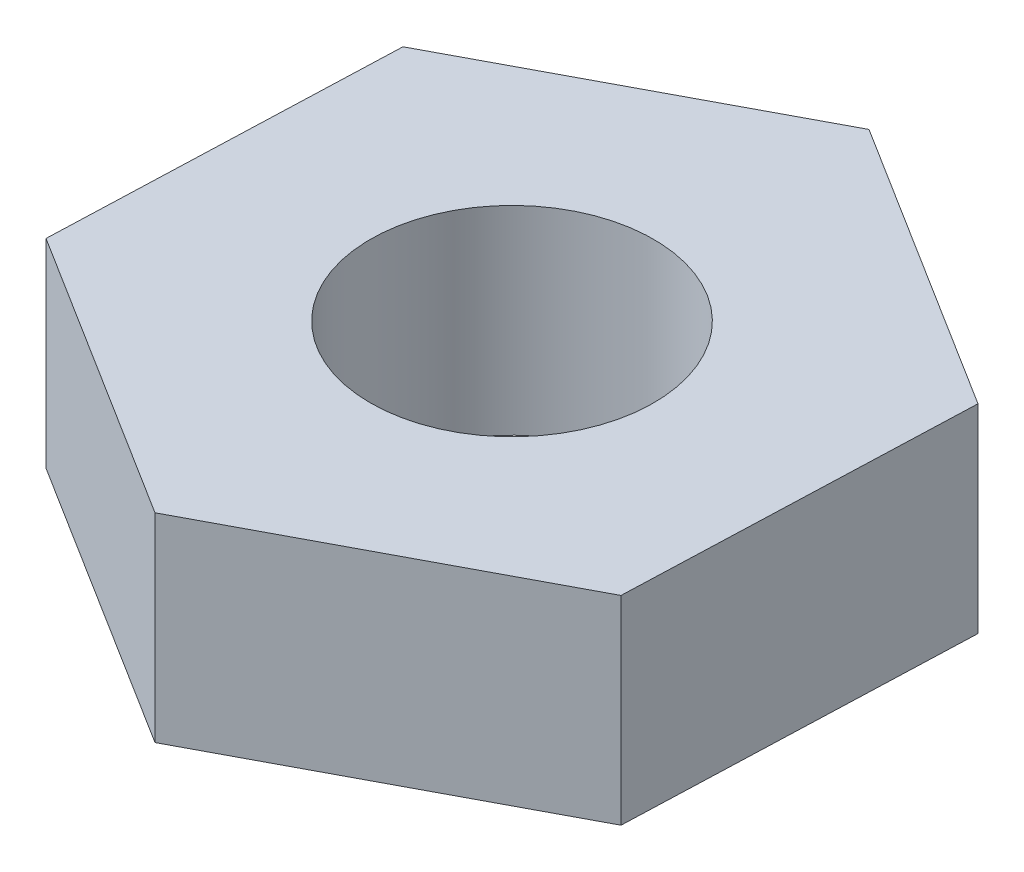
ISO-10303-21;
HEADER;
FILE_DESCRIPTION(('STEP AP214'),'2;1');
FILE_NAME('part.step','',(''),(''),'','','');
FILE_SCHEMA(('AUTOMOTIVE_DESIGN { 1 0 10303 214 1 1 1 1 }'));
ENDSEC;
DATA;
#1=APPLICATION_CONTEXT('core data for automotive mechanical design processes');
#2=APPLICATION_PROTOCOL_DEFINITION('international standard','automotive_design',2000,#1);
#3=PRODUCT_CONTEXT('',#1,'mechanical');
#4=PRODUCT('Part','Part','',(#3));
#5=PRODUCT_RELATED_PRODUCT_CATEGORY('part','',(#4));
#6=PRODUCT_DEFINITION_FORMATION('','',#4);
#7=PRODUCT_DEFINITION_CONTEXT('part definition',#1,'design');
#8=PRODUCT_DEFINITION('design','',#6,#7);
#9=PRODUCT_DEFINITION_SHAPE('','',#8);
#10=(LENGTH_UNIT() NAMED_UNIT(*) SI_UNIT(.MILLI.,.METRE.));
#11=(NAMED_UNIT(*) PLANE_ANGLE_UNIT() SI_UNIT($,.RADIAN.));
#12=(NAMED_UNIT(*) SI_UNIT($,.STERADIAN.) SOLID_ANGLE_UNIT());
#13=UNCERTAINTY_MEASURE_WITH_UNIT(LENGTH_MEASURE(1.E-05),#10,'distance_accuracy_value','');
#14=(GEOMETRIC_REPRESENTATION_CONTEXT(3) GLOBAL_UNCERTAINTY_ASSIGNED_CONTEXT((#13)) GLOBAL_UNIT_ASSIGNED_CONTEXT((#10,
#11,#12)) REPRESENTATION_CONTEXT('',''));
#15=CARTESIAN_POINT('',(0.,0.,0.));
#16=DIRECTION('',(0.,0.,1.));
#17=DIRECTION('',(1.,0.,0.));
#18=AXIS2_PLACEMENT_3D('',#15,#16,#17);
#19=CARTESIAN_POINT('',(-0.0997809781891739,1.5875,2.74781959131083));
#20=DIRECTION('',(-0.468243591350759,0.,-0.883599422339639));
#21=DIRECTION('',(-0.883599422339639,0.,0.468243591350759));
#22=AXIS2_PLACEMENT_3D('',#19,#20,#21);
#23=PLANE('',#22);
#24=DIRECTION('',(0.883599422339639,0.,-0.468243591350759));
#25=VECTOR('',#24,1.);
#26=CARTESIAN_POINT('',(-0.0997809781891739,0.,2.74781959131083));
#27=LINE('',#26,#25);
#28=CARTESIAN_POINT('',(-0.0997809781891739,0.,2.74781959131083));
#29=VERTEX_POINT('',#28);
#30=CARTESIAN_POINT('',(2.32979108199716,0.,1.4603226575817));
#31=VERTEX_POINT('',#30);
#32=EDGE_CURVE('E119',#29,#31,#27,.T.);
#33=ORIENTED_EDGE('',*,*,#32,.T.);
#34=DIRECTION('',(0.,-1.,0.));
#35=VECTOR('',#34,1.);
#36=CARTESIAN_POINT('',(2.32979108199716,1.5875,1.4603226575817));
#37=LINE('',#36,#35);
#38=CARTESIAN_POINT('',(2.32979108199716,1.5875,1.4603226575817));
#39=VERTEX_POINT('',#38);
#40=EDGE_CURVE('E11',#39,#31,#37,.T.);
#41=ORIENTED_EDGE('',*,*,#40,.F.);
#42=DIRECTION('',(0.883599422339639,0.,-0.468243591350759));
#43=VECTOR('',#42,1.);
#44=CARTESIAN_POINT('',(-0.0997809781891739,1.5875,2.74781959131083));
#45=LINE('',#44,#43);
#46=CARTESIAN_POINT('',(-0.0997809781891739,1.5875,2.74781959131083));
#47=VERTEX_POINT('',#46);
#48=EDGE_CURVE('E130',#47,#39,#45,.T.);
#49=ORIENTED_EDGE('',*,*,#48,.F.);
#50=DIRECTION('',(0.,-1.,0.));
#51=VECTOR('',#50,1.);
#52=CARTESIAN_POINT('',(-0.0997809781891739,1.5875,2.74781959131083));
#53=LINE('',#52,#51);
#54=EDGE_CURVE('E115',#47,#29,#53,.T.);
#55=ORIENTED_EDGE('',*,*,#54,.T.);
#56=EDGE_LOOP('',(#33,#41,#49,#55));
#57=FACE_BOUND('',#56,.T.);
#58=ADVANCED_FACE('F35',(#57),#23,.F.);
#59=CARTESIAN_POINT('',(2.32979108199716,1.5875,1.4603226575817));
#60=DIRECTION('',(-0.999341342190762,0.,-0.0362888659008025));
#61=DIRECTION('',(-0.0362888659008025,0.,0.999341342190762));
#62=AXIS2_PLACEMENT_3D('',#59,#60,#61);
#63=PLANE('',#62);
#64=DIRECTION('',(0.0362888659008025,0.,-0.999341342190762));
#65=VECTOR('',#64,1.);
#66=CARTESIAN_POINT('',(2.32979108199716,0.,1.4603226575817));
#67=LINE('',#66,#65);
#68=CARTESIAN_POINT('',(2.42957206018634,0.,-1.28749693372913));
#69=VERTEX_POINT('',#68);
#70=EDGE_CURVE('E122',#31,#69,#67,.T.);
#71=ORIENTED_EDGE('',*,*,#70,.T.);
#72=DIRECTION('',(0.,-1.,0.));
#73=VECTOR('',#72,1.);
#74=CARTESIAN_POINT('',(2.42957206018634,1.5875,-1.28749693372913));
#75=LINE('',#74,#73);
#76=CARTESIAN_POINT('',(2.42957206018634,1.5875,-1.28749693372913));
#77=VERTEX_POINT('',#76);
#78=EDGE_CURVE('E43',#77,#69,#75,.T.);
#79=ORIENTED_EDGE('',*,*,#78,.F.);
#80=DIRECTION('',(0.0362888659008025,0.,-0.999341342190762));
#81=VECTOR('',#80,1.);
#82=CARTESIAN_POINT('',(2.32979108199716,1.5875,1.4603226575817));
#83=LINE('',#82,#81);
#84=EDGE_CURVE('E88',#39,#77,#83,.T.);
#85=ORIENTED_EDGE('',*,*,#84,.F.);
#86=ORIENTED_EDGE('',*,*,#40,.T.);
#87=EDGE_LOOP('',(#71,#79,#85,#86));
#88=FACE_BOUND('',#87,.T.);
#89=ADVANCED_FACE('F156',(#88),#63,.F.);
#90=CARTESIAN_POINT('',(2.42957206018634,1.5875,-1.28749693372913));
#91=DIRECTION('',(-0.531097750840003,0.,0.847310556438836));
#92=DIRECTION('',(0.847310556438836,0.,0.531097750840003));
#93=AXIS2_PLACEMENT_3D('',#90,#91,#92);
#94=PLANE('',#93);
#95=DIRECTION('',(-0.847310556438836,0.,-0.531097750840003));
#96=VECTOR('',#95,1.);
#97=CARTESIAN_POINT('',(2.42957206018634,0.,-1.28749693372913));
#98=LINE('',#97,#96);
#99=CARTESIAN_POINT('',(0.0997809781891751,0.,-2.74781959131083));
#100=VERTEX_POINT('',#99);
#101=EDGE_CURVE('E125',#69,#100,#98,.T.);
#102=ORIENTED_EDGE('',*,*,#101,.T.);
#103=DIRECTION('',(0.,-1.,0.));
#104=VECTOR('',#103,1.);
#105=CARTESIAN_POINT('',(0.0997809781891751,1.5875,-2.74781959131083));
#106=LINE('',#105,#104);
#107=CARTESIAN_POINT('',(0.0997809781891751,1.5875,-2.74781959131083));
#108=VERTEX_POINT('',#107);
#109=EDGE_CURVE('E110',#108,#100,#106,.T.);
#110=ORIENTED_EDGE('',*,*,#109,.F.);
#111=DIRECTION('',(-0.847310556438836,0.,-0.531097750840003));
#112=VECTOR('',#111,1.);
#113=CARTESIAN_POINT('',(2.42957206018634,1.5875,-1.28749693372913));
#114=LINE('',#113,#112);
#115=EDGE_CURVE('E101',#77,#108,#114,.T.);
#116=ORIENTED_EDGE('',*,*,#115,.F.);
#117=ORIENTED_EDGE('',*,*,#78,.T.);
#118=EDGE_LOOP('',(#102,#110,#116,#117));
#119=FACE_BOUND('',#118,.T.);
#120=ADVANCED_FACE('F136',(#119),#94,.F.);
#121=CARTESIAN_POINT('',(0.0997809781891751,1.5875,-2.74781959131083));
#122=DIRECTION('',(0.468243591350759,0.,0.883599422339639));
#123=DIRECTION('',(0.883599422339639,0.,-0.468243591350759));
#124=AXIS2_PLACEMENT_3D('',#121,#122,#123);
#125=PLANE('',#124);
#126=DIRECTION('',(-0.883599422339639,0.,0.468243591350759));
#127=VECTOR('',#126,1.);
#128=CARTESIAN_POINT('',(0.0997809781891751,0.,-2.74781959131083));
#129=LINE('',#128,#127);
#130=CARTESIAN_POINT('',(-2.32979108199716,0.,-1.4603226575817));
#131=VERTEX_POINT('',#130);
#132=EDGE_CURVE('E109',#100,#131,#129,.T.);
#133=ORIENTED_EDGE('',*,*,#132,.T.);
#134=DIRECTION('',(0.,-1.,0.));
#135=VECTOR('',#134,1.);
#136=CARTESIAN_POINT('',(-2.32979108199716,1.5875,-1.4603226575817));
#137=LINE('',#136,#135);
#138=CARTESIAN_POINT('',(-2.32979108199716,1.5875,-1.4603226575817));
#139=VERTEX_POINT('',#138);
#140=EDGE_CURVE('E106',#139,#131,#137,.T.);
#141=ORIENTED_EDGE('',*,*,#140,.F.);
#142=DIRECTION('',(-0.883599422339639,0.,0.468243591350759));
#143=VECTOR('',#142,1.);
#144=CARTESIAN_POINT('',(0.0997809781891751,1.5875,-2.74781959131083));
#145=LINE('',#144,#143);
#146=EDGE_CURVE('E95',#108,#139,#145,.T.);
#147=ORIENTED_EDGE('',*,*,#146,.F.);
#148=ORIENTED_EDGE('',*,*,#109,.T.);
#149=EDGE_LOOP('',(#133,#141,#147,#148));
#150=FACE_BOUND('',#149,.T.);
#151=ADVANCED_FACE('F107',(#150),#125,.F.);
#152=CARTESIAN_POINT('',(-2.32979108199716,1.5875,-1.4603226575817));
#153=DIRECTION('',(0.999341342190762,0.,0.0362888659008027));
#154=DIRECTION('',(0.0362888659008027,0.,-0.999341342190762));
#155=AXIS2_PLACEMENT_3D('',#152,#153,#154);
#156=PLANE('',#155);
#157=DIRECTION('',(-0.0362888659008027,0.,0.999341342190762));
#158=VECTOR('',#157,1.);
#159=CARTESIAN_POINT('',(-2.32979108199716,0.,-1.4603226575817));
#160=LINE('',#159,#158);
#161=CARTESIAN_POINT('',(-2.42957206018634,0.,1.28749693372913));
#162=VERTEX_POINT('',#161);
#163=EDGE_CURVE('E74',#131,#162,#160,.T.);
#164=ORIENTED_EDGE('',*,*,#163,.T.);
#165=DIRECTION('',(0.,-1.,0.));
#166=VECTOR('',#165,1.);
#167=CARTESIAN_POINT('',(-2.42957206018634,1.5875,1.28749693372913));
#168=LINE('',#167,#166);
#169=CARTESIAN_POINT('',(-2.42957206018634,1.5875,1.28749693372913));
#170=VERTEX_POINT('',#169);
#171=EDGE_CURVE('E111',#170,#162,#168,.T.);
#172=ORIENTED_EDGE('',*,*,#171,.F.);
#173=DIRECTION('',(-0.0362888659008027,0.,0.999341342190762));
#174=VECTOR('',#173,1.);
#175=CARTESIAN_POINT('',(-2.32979108199716,1.5875,-1.4603226575817));
#176=LINE('',#175,#174);
#177=EDGE_CURVE('E99',#139,#170,#176,.T.);
#178=ORIENTED_EDGE('',*,*,#177,.F.);
#179=ORIENTED_EDGE('',*,*,#140,.T.);
#180=EDGE_LOOP('',(#164,#172,#178,#179));
#181=FACE_BOUND('',#180,.T.);
#182=ADVANCED_FACE('F113',(#181),#156,.F.);
#183=CARTESIAN_POINT('',(-2.42957206018634,1.5875,1.28749693372913));
#184=DIRECTION('',(0.531097750840003,0.,-0.847310556438836));
#185=DIRECTION('',(-0.847310556438836,0.,-0.531097750840003));
#186=AXIS2_PLACEMENT_3D('',#183,#184,#185);
#187=PLANE('',#186);
#188=DIRECTION('',(0.847310556438836,0.,0.531097750840003));
#189=VECTOR('',#188,1.);
#190=CARTESIAN_POINT('',(-2.42957206018634,0.,1.28749693372913));
#191=LINE('',#190,#189);
#192=EDGE_CURVE('E80',#162,#29,#191,.T.);
#193=ORIENTED_EDGE('',*,*,#192,.T.);
#194=ORIENTED_EDGE('',*,*,#54,.F.);
#195=DIRECTION('',(0.847310556438836,0.,0.531097750840003));
#196=VECTOR('',#195,1.);
#197=CARTESIAN_POINT('',(-2.42957206018634,1.5875,1.28749693372913));
#198=LINE('',#197,#196);
#199=EDGE_CURVE('E51',#170,#47,#198,.T.);
#200=ORIENTED_EDGE('',*,*,#199,.F.);
#201=ORIENTED_EDGE('',*,*,#171,.T.);
#202=EDGE_LOOP('',(#193,#194,#200,#201));
#203=FACE_BOUND('',#202,.T.);
#204=ADVANCED_FACE('F143',(#203),#187,.F.);
#205=CARTESIAN_POINT('',(0.,1.5875,0.));
#206=DIRECTION('',(0.,1.,0.));
#207=DIRECTION('',(0.,0.,1.));
#208=AXIS2_PLACEMENT_3D('',#205,#206,#207);
#209=PLANE('',#208);
#210=CARTESIAN_POINT('',(0.,1.5875,0.));
#211=DIRECTION('',(0.,1.,0.));
#212=DIRECTION('',(0.,0.,1.));
#213=AXIS2_PLACEMENT_3D('',#210,#211,#212);
#214=CIRCLE('',#213,1.1303);
#215=CARTESIAN_POINT('',(0.,1.5875,1.1303));
#216=VERTEX_POINT('',#215);
#217=EDGE_CURVE('E212',#216,#216,#214,.T.);
#218=ORIENTED_EDGE('',*,*,#217,.F.);
#219=EDGE_LOOP('',(#218));
#220=FACE_BOUND('',#219,.T.);
#221=ORIENTED_EDGE('',*,*,#48,.T.);
#222=ORIENTED_EDGE('',*,*,#84,.T.);
#223=ORIENTED_EDGE('',*,*,#115,.T.);
#224=ORIENTED_EDGE('',*,*,#146,.T.);
#225=ORIENTED_EDGE('',*,*,#177,.T.);
#226=ORIENTED_EDGE('',*,*,#199,.T.);
#227=EDGE_LOOP('',(#221,#222,#223,#224,#225,#226));
#228=FACE_BOUND('',#227,.T.);
#229=ADVANCED_FACE('F97',(#220,#228),#209,.T.);
#230=CARTESIAN_POINT('',(0.,0.,0.));
#231=DIRECTION('',(0.,1.,0.));
#232=DIRECTION('',(0.,0.,1.));
#233=AXIS2_PLACEMENT_3D('',#230,#231,#232);
#234=PLANE('',#233);
#235=CARTESIAN_POINT('',(0.,0.,0.));
#236=DIRECTION('',(0.,1.,0.));
#237=DIRECTION('',(0.,0.,1.));
#238=AXIS2_PLACEMENT_3D('',#235,#236,#237);
#239=CIRCLE('',#238,1.1303);
#240=CARTESIAN_POINT('',(0.,0.,1.1303));
#241=VERTEX_POINT('',#240);
#242=EDGE_CURVE('E123',#241,#241,#239,.T.);
#243=ORIENTED_EDGE('',*,*,#242,.T.);
#244=EDGE_LOOP('',(#243));
#245=FACE_BOUND('',#244,.T.);
#246=ORIENTED_EDGE('',*,*,#32,.F.);
#247=ORIENTED_EDGE('',*,*,#192,.F.);
#248=ORIENTED_EDGE('',*,*,#163,.F.);
#249=ORIENTED_EDGE('',*,*,#132,.F.);
#250=ORIENTED_EDGE('',*,*,#101,.F.);
#251=ORIENTED_EDGE('',*,*,#70,.F.);
#252=EDGE_LOOP('',(#246,#247,#248,#249,#250,#251));
#253=FACE_BOUND('',#252,.T.);
#254=ADVANCED_FACE('F139',(#245,#253),#234,.F.);
#255=CARTESIAN_POINT('',(0.,1.5875,0.));
#256=DIRECTION('',(0.,1.,0.));
#257=DIRECTION('',(0.,0.,1.));
#258=AXIS2_PLACEMENT_3D('',#255,#256,#257);
#259=CYLINDRICAL_SURFACE('',#258,1.1303);
#260=ORIENTED_EDGE('',*,*,#242,.F.);
#261=EDGE_LOOP('',(#260));
#262=FACE_BOUND('',#261,.T.);
#263=ORIENTED_EDGE('',*,*,#217,.T.);
#264=EDGE_LOOP('',(#263));
#265=FACE_BOUND('',#264,.T.);
#266=ADVANCED_FACE('F189',(#262,#265),#259,.F.);
#267=CLOSED_SHELL('',(#58,#89,#120,#151,#182,#204,#229,#254,#266));
#268=MANIFOLD_SOLID_BREP('B2',#267);
#269=ADVANCED_BREP_SHAPE_REPRESENTATION('',(#18,#268),#14);
#270=SHAPE_DEFINITION_REPRESENTATION(#9,#269);
ENDSEC;
END-ISO-10303-21;
